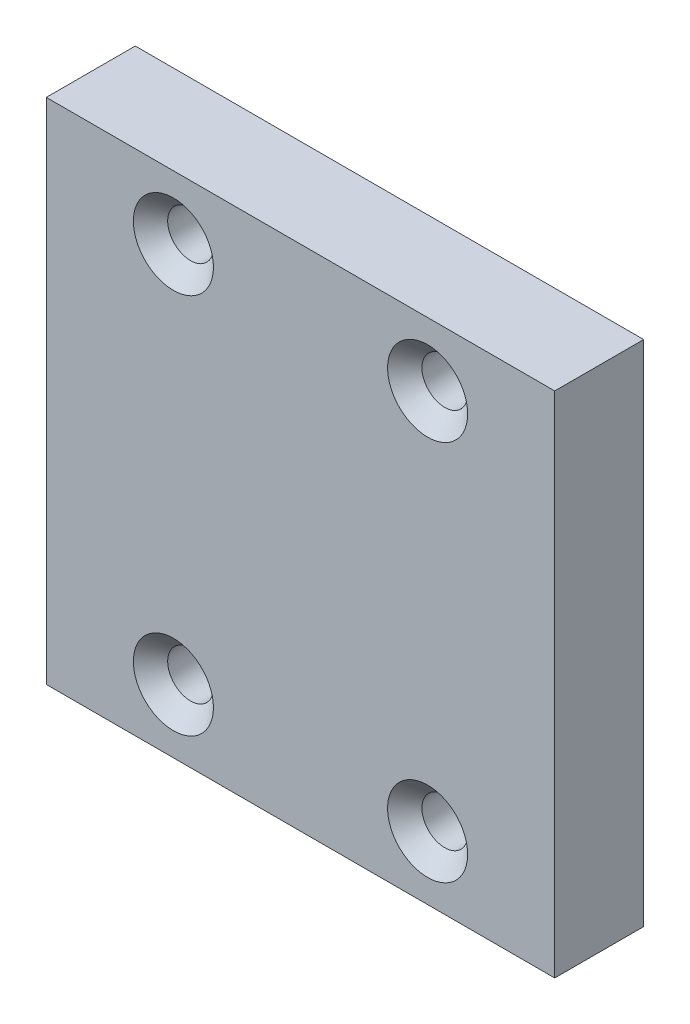
ISO-10303-21;
HEADER;
FILE_DESCRIPTION(('STEP AP214'),'2;1');
FILE_NAME('part.step','',(''),(''),'','','');
FILE_SCHEMA(('AUTOMOTIVE_DESIGN { 1 0 10303 214 1 1 1 1 }'));
ENDSEC;
DATA;
#1=APPLICATION_CONTEXT('core data for automotive mechanical design processes');
#2=APPLICATION_PROTOCOL_DEFINITION('international standard','automotive_design',2000,#1);
#3=PRODUCT_CONTEXT('',#1,'mechanical');
#4=PRODUCT('Part','Part','',(#3));
#5=PRODUCT_RELATED_PRODUCT_CATEGORY('part','',(#4));
#6=PRODUCT_DEFINITION_FORMATION('','',#4);
#7=PRODUCT_DEFINITION_CONTEXT('part definition',#1,'design');
#8=PRODUCT_DEFINITION('design','',#6,#7);
#9=PRODUCT_DEFINITION_SHAPE('','',#8);
#10=(LENGTH_UNIT() NAMED_UNIT(*) SI_UNIT(.MILLI.,.METRE.));
#11=(NAMED_UNIT(*) PLANE_ANGLE_UNIT() SI_UNIT($,.RADIAN.));
#12=(NAMED_UNIT(*) SI_UNIT($,.STERADIAN.) SOLID_ANGLE_UNIT());
#13=UNCERTAINTY_MEASURE_WITH_UNIT(LENGTH_MEASURE(1.E-05),#10,'distance_accuracy_value','');
#14=(GEOMETRIC_REPRESENTATION_CONTEXT(3) GLOBAL_UNCERTAINTY_ASSIGNED_CONTEXT((#13)) GLOBAL_UNIT_ASSIGNED_CONTEXT((#10,
#11,#12)) REPRESENTATION_CONTEXT('',''));
#15=CARTESIAN_POINT('',(0.,0.,0.));
#16=DIRECTION('',(0.,0.,1.));
#17=DIRECTION('',(1.,0.,0.));
#18=AXIS2_PLACEMENT_3D('',#15,#16,#17);
#19=CARTESIAN_POINT('',(-20.,-20.,7.));
#20=DIRECTION('',(1.,0.,0.));
#21=DIRECTION('',(0.,0.,-1.));
#22=AXIS2_PLACEMENT_3D('',#19,#20,#21);
#23=PLANE('',#22);
#24=DIRECTION('',(0.,-1.,0.));
#25=VECTOR('',#24,1.);
#26=CARTESIAN_POINT('',(-20.,-20.,0.));
#27=LINE('',#26,#25);
#28=CARTESIAN_POINT('',(-20.,20.,0.));
#29=VERTEX_POINT('',#28);
#30=CARTESIAN_POINT('',(-20.,-20.,0.));
#31=VERTEX_POINT('',#30);
#32=EDGE_CURVE('E110',#29,#31,#27,.T.);
#33=ORIENTED_EDGE('',*,*,#32,.T.);
#34=DIRECTION('',(0.,0.,-1.));
#35=VECTOR('',#34,1.);
#36=CARTESIAN_POINT('',(-20.,-20.,7.));
#37=LINE('',#36,#35);
#38=CARTESIAN_POINT('',(-20.,-20.,7.));
#39=VERTEX_POINT('',#38);
#40=EDGE_CURVE('E11',#39,#31,#37,.T.);
#41=ORIENTED_EDGE('',*,*,#40,.F.);
#42=DIRECTION('',(0.,-1.,0.));
#43=VECTOR('',#42,1.);
#44=CARTESIAN_POINT('',(-20.,-20.,7.));
#45=LINE('',#44,#43);
#46=CARTESIAN_POINT('',(-20.,20.,7.));
#47=VERTEX_POINT('',#46);
#48=EDGE_CURVE('E93',#47,#39,#45,.T.);
#49=ORIENTED_EDGE('',*,*,#48,.F.);
#50=DIRECTION('',(0.,0.,-1.));
#51=VECTOR('',#50,1.);
#52=CARTESIAN_POINT('',(-20.,20.,7.));
#53=LINE('',#52,#51);
#54=EDGE_CURVE('E106',#47,#29,#53,.T.);
#55=ORIENTED_EDGE('',*,*,#54,.T.);
#56=EDGE_LOOP('',(#33,#41,#49,#55));
#57=FACE_BOUND('',#56,.T.);
#58=ADVANCED_FACE('F39',(#57),#23,.F.);
#59=CARTESIAN_POINT('',(20.,-20.,7.));
#60=DIRECTION('',(0.,1.,0.));
#61=DIRECTION('',(-1.,0.,0.));
#62=AXIS2_PLACEMENT_3D('',#59,#60,#61);
#63=PLANE('',#62);
#64=DIRECTION('',(1.,0.,0.));
#65=VECTOR('',#64,1.);
#66=CARTESIAN_POINT('',(20.,-20.,0.));
#67=LINE('',#66,#65);
#68=CARTESIAN_POINT('',(20.,-20.,0.));
#69=VERTEX_POINT('',#68);
#70=EDGE_CURVE('E98',#31,#69,#67,.T.);
#71=ORIENTED_EDGE('',*,*,#70,.T.);
#72=DIRECTION('',(0.,0.,-1.));
#73=VECTOR('',#72,1.);
#74=CARTESIAN_POINT('',(20.,-20.,7.));
#75=LINE('',#74,#73);
#76=CARTESIAN_POINT('',(20.,-20.,7.));
#77=VERTEX_POINT('',#76);
#78=EDGE_CURVE('E49',#77,#69,#75,.T.);
#79=ORIENTED_EDGE('',*,*,#78,.F.);
#80=DIRECTION('',(1.,0.,0.));
#81=VECTOR('',#80,1.);
#82=CARTESIAN_POINT('',(20.,-20.,7.));
#83=LINE('',#82,#81);
#84=EDGE_CURVE('E88',#39,#77,#83,.T.);
#85=ORIENTED_EDGE('',*,*,#84,.F.);
#86=ORIENTED_EDGE('',*,*,#40,.T.);
#87=EDGE_LOOP('',(#71,#79,#85,#86));
#88=FACE_BOUND('',#87,.T.);
#89=ADVANCED_FACE('F97',(#88),#63,.F.);
#90=CARTESIAN_POINT('',(20.,-20.,7.));
#91=DIRECTION('',(-1.,0.,0.));
#92=DIRECTION('',(0.,0.,1.));
#93=AXIS2_PLACEMENT_3D('',#90,#91,#92);
#94=PLANE('',#93);
#95=DIRECTION('',(0.,1.,0.));
#96=VECTOR('',#95,1.);
#97=CARTESIAN_POINT('',(20.,-20.,0.));
#98=LINE('',#97,#96);
#99=CARTESIAN_POINT('',(20.,20.,0.));
#100=VERTEX_POINT('',#99);
#101=EDGE_CURVE('E75',#69,#100,#98,.T.);
#102=ORIENTED_EDGE('',*,*,#101,.T.);
#103=DIRECTION('',(0.,0.,-1.));
#104=VECTOR('',#103,1.);
#105=CARTESIAN_POINT('',(20.,20.,7.));
#106=LINE('',#105,#104);
#107=CARTESIAN_POINT('',(20.,20.,7.));
#108=VERTEX_POINT('',#107);
#109=EDGE_CURVE('E100',#108,#100,#106,.T.);
#110=ORIENTED_EDGE('',*,*,#109,.F.);
#111=DIRECTION('',(0.,1.,0.));
#112=VECTOR('',#111,1.);
#113=CARTESIAN_POINT('',(20.,-20.,7.));
#114=LINE('',#113,#112);
#115=EDGE_CURVE('E91',#77,#108,#114,.T.);
#116=ORIENTED_EDGE('',*,*,#115,.F.);
#117=ORIENTED_EDGE('',*,*,#78,.T.);
#118=EDGE_LOOP('',(#102,#110,#116,#117));
#119=FACE_BOUND('',#118,.T.);
#120=ADVANCED_FACE('F102',(#119),#94,.F.);
#121=CARTESIAN_POINT('',(20.,20.,7.));
#122=DIRECTION('',(0.,-1.,0.));
#123=DIRECTION('',(1.,0.,0.));
#124=AXIS2_PLACEMENT_3D('',#121,#122,#123);
#125=PLANE('',#124);
#126=DIRECTION('',(-1.,0.,0.));
#127=VECTOR('',#126,1.);
#128=CARTESIAN_POINT('',(20.,20.,0.));
#129=LINE('',#128,#127);
#130=EDGE_CURVE('E81',#100,#29,#129,.T.);
#131=ORIENTED_EDGE('',*,*,#130,.T.);
#132=ORIENTED_EDGE('',*,*,#54,.F.);
#133=DIRECTION('',(-1.,0.,0.));
#134=VECTOR('',#133,1.);
#135=CARTESIAN_POINT('',(20.,20.,7.));
#136=LINE('',#135,#134);
#137=EDGE_CURVE('E58',#108,#47,#136,.T.);
#138=ORIENTED_EDGE('',*,*,#137,.F.);
#139=ORIENTED_EDGE('',*,*,#109,.T.);
#140=EDGE_LOOP('',(#131,#132,#138,#139));
#141=FACE_BOUND('',#140,.T.);
#142=ADVANCED_FACE('F178',(#141),#125,.F.);
#143=CARTESIAN_POINT('',(0.,0.,7.));
#144=DIRECTION('',(0.,0.,1.));
#145=DIRECTION('',(1.,0.,0.));
#146=AXIS2_PLACEMENT_3D('',#143,#144,#145);
#147=PLANE('',#146);
#148=CARTESIAN_POINT('',(10.,-15.,7.));
#149=DIRECTION('',(0.,0.,1.));
#150=DIRECTION('',(1.,0.,0.));
#151=AXIS2_PLACEMENT_3D('',#148,#149,#150);
#152=CIRCLE('',#151,3.15);
#153=CARTESIAN_POINT('',(13.15,-15.,7.));
#154=VERTEX_POINT('',#153);
#155=EDGE_CURVE('E298',#154,#154,#152,.T.);
#156=ORIENTED_EDGE('',*,*,#155,.F.);
#157=EDGE_LOOP('',(#156));
#158=FACE_BOUND('',#157,.T.);
#159=CARTESIAN_POINT('',(10.,15.,7.));
#160=DIRECTION('',(0.,0.,1.));
#161=DIRECTION('',(1.,0.,0.));
#162=AXIS2_PLACEMENT_3D('',#159,#160,#161);
#163=CIRCLE('',#162,3.15);
#164=CARTESIAN_POINT('',(13.15,15.,7.));
#165=VERTEX_POINT('',#164);
#166=EDGE_CURVE('E146',#165,#165,#163,.T.);
#167=ORIENTED_EDGE('',*,*,#166,.F.);
#168=EDGE_LOOP('',(#167));
#169=FACE_BOUND('',#168,.T.);
#170=CARTESIAN_POINT('',(-10.,-15.,7.));
#171=DIRECTION('',(0.,0.,1.));
#172=DIRECTION('',(1.,0.,0.));
#173=AXIS2_PLACEMENT_3D('',#170,#171,#172);
#174=CIRCLE('',#173,3.15);
#175=CARTESIAN_POINT('',(-6.85,-15.,7.));
#176=VERTEX_POINT('',#175);
#177=EDGE_CURVE('E137',#176,#176,#174,.T.);
#178=ORIENTED_EDGE('',*,*,#177,.F.);
#179=EDGE_LOOP('',(#178));
#180=FACE_BOUND('',#179,.T.);
#181=CARTESIAN_POINT('',(-10.,15.,7.));
#182=DIRECTION('',(0.,0.,1.));
#183=DIRECTION('',(1.,0.,0.));
#184=AXIS2_PLACEMENT_3D('',#181,#182,#183);
#185=CIRCLE('',#184,3.15);
#186=CARTESIAN_POINT('',(-6.85,15.,7.));
#187=VERTEX_POINT('',#186);
#188=EDGE_CURVE('E132',#187,#187,#185,.T.);
#189=ORIENTED_EDGE('',*,*,#188,.F.);
#190=EDGE_LOOP('',(#189));
#191=FACE_BOUND('',#190,.T.);
#192=ORIENTED_EDGE('',*,*,#48,.T.);
#193=ORIENTED_EDGE('',*,*,#84,.T.);
#194=ORIENTED_EDGE('',*,*,#115,.T.);
#195=ORIENTED_EDGE('',*,*,#137,.T.);
#196=EDGE_LOOP('',(#192,#193,#194,#195));
#197=FACE_BOUND('',#196,.T.);
#198=ADVANCED_FACE('F89',(#158,#169,#180,#191,#197),#147,.T.);
#199=CARTESIAN_POINT('',(0.,0.,0.));
#200=DIRECTION('',(0.,0.,1.));
#201=DIRECTION('',(1.,0.,0.));
#202=AXIS2_PLACEMENT_3D('',#199,#200,#201);
#203=PLANE('',#202);
#204=CARTESIAN_POINT('',(10.,-15.,0.));
#205=DIRECTION('',(0.,0.,1.));
#206=DIRECTION('',(1.,0.,0.));
#207=AXIS2_PLACEMENT_3D('',#204,#205,#206);
#208=CIRCLE('',#207,1.79999999999999);
#209=CARTESIAN_POINT('',(11.8,-15.,0.));
#210=VERTEX_POINT('',#209);
#211=EDGE_CURVE('E42',#210,#210,#208,.T.);
#212=ORIENTED_EDGE('',*,*,#211,.T.);
#213=EDGE_LOOP('',(#212));
#214=FACE_BOUND('',#213,.T.);
#215=CARTESIAN_POINT('',(10.,15.,0.));
#216=DIRECTION('',(0.,0.,1.));
#217=DIRECTION('',(1.,0.,0.));
#218=AXIS2_PLACEMENT_3D('',#215,#216,#217);
#219=CIRCLE('',#218,1.79999999999999);
#220=CARTESIAN_POINT('',(11.8,15.,0.));
#221=VERTEX_POINT('',#220);
#222=EDGE_CURVE('E134',#221,#221,#219,.T.);
#223=ORIENTED_EDGE('',*,*,#222,.T.);
#224=EDGE_LOOP('',(#223));
#225=FACE_BOUND('',#224,.T.);
#226=CARTESIAN_POINT('',(-10.,-15.,0.));
#227=DIRECTION('',(0.,0.,1.));
#228=DIRECTION('',(1.,0.,0.));
#229=AXIS2_PLACEMENT_3D('',#226,#227,#228);
#230=CIRCLE('',#229,1.79999999999999);
#231=CARTESIAN_POINT('',(-8.20000000000001,-15.,0.));
#232=VERTEX_POINT('',#231);
#233=EDGE_CURVE('E129',#232,#232,#230,.T.);
#234=ORIENTED_EDGE('',*,*,#233,.T.);
#235=EDGE_LOOP('',(#234));
#236=FACE_BOUND('',#235,.T.);
#237=CARTESIAN_POINT('',(-10.,15.,0.));
#238=DIRECTION('',(0.,0.,1.));
#239=DIRECTION('',(1.,0.,0.));
#240=AXIS2_PLACEMENT_3D('',#237,#238,#239);
#241=CIRCLE('',#240,1.79999999999999);
#242=CARTESIAN_POINT('',(-8.20000000000001,15.,0.));
#243=VERTEX_POINT('',#242);
#244=EDGE_CURVE('E114',#243,#243,#241,.T.);
#245=ORIENTED_EDGE('',*,*,#244,.T.);
#246=EDGE_LOOP('',(#245));
#247=FACE_BOUND('',#246,.T.);
#248=ORIENTED_EDGE('',*,*,#32,.F.);
#249=ORIENTED_EDGE('',*,*,#130,.F.);
#250=ORIENTED_EDGE('',*,*,#101,.F.);
#251=ORIENTED_EDGE('',*,*,#70,.F.);
#252=EDGE_LOOP('',(#248,#249,#250,#251));
#253=FACE_BOUND('',#252,.T.);
#254=ADVANCED_FACE('F177',(#214,#225,#236,#247,#253),#203,.F.);
#255=CARTESIAN_POINT('',(-10.,15.,7.));
#256=DIRECTION('',(0.,0.,1.));
#257=DIRECTION('',(1.,0.,0.));
#258=AXIS2_PLACEMENT_3D('',#255,#256,#257);
#259=CYLINDRICAL_SURFACE('',#258,1.79999999999999);
#260=CARTESIAN_POINT('',(-10.,15.,5.65));
#261=DIRECTION('',(0.,0.,1.));
#262=DIRECTION('',(1.,0.,0.));
#263=AXIS2_PLACEMENT_3D('',#260,#261,#262);
#264=CIRCLE('',#263,1.8);
#265=CARTESIAN_POINT('',(-8.2,15.,5.65));
#266=VERTEX_POINT('',#265);
#267=EDGE_CURVE('E128',#266,#266,#264,.T.);
#268=ORIENTED_EDGE('',*,*,#267,.T.);
#269=EDGE_LOOP('',(#268));
#270=FACE_BOUND('',#269,.T.);
#271=ORIENTED_EDGE('',*,*,#244,.F.);
#272=EDGE_LOOP('',(#271));
#273=FACE_BOUND('',#272,.T.);
#274=ADVANCED_FACE('F166',(#270,#273),#259,.F.);
#275=CARTESIAN_POINT('',(-10.,15.,7.));
#276=DIRECTION('',(0.,0.,1.));
#277=DIRECTION('',(1.,0.,0.));
#278=AXIS2_PLACEMENT_3D('',#275,#276,#277);
#279=CONICAL_SURFACE('',#278,3.15,0.785398163397448);
#280=ORIENTED_EDGE('',*,*,#267,.F.);
#281=EDGE_LOOP('',(#280));
#282=FACE_BOUND('',#281,.T.);
#283=ORIENTED_EDGE('',*,*,#188,.T.);
#284=EDGE_LOOP('',(#283));
#285=FACE_BOUND('',#284,.T.);
#286=ADVANCED_FACE('F169',(#282,#285),#279,.F.);
#287=CARTESIAN_POINT('',(-10.,-15.,7.));
#288=DIRECTION('',(0.,0.,1.));
#289=DIRECTION('',(1.,0.,0.));
#290=AXIS2_PLACEMENT_3D('',#287,#288,#289);
#291=CYLINDRICAL_SURFACE('',#290,1.79999999999999);
#292=CARTESIAN_POINT('',(-10.,-15.,5.65));
#293=DIRECTION('',(0.,0.,1.));
#294=DIRECTION('',(1.,0.,0.));
#295=AXIS2_PLACEMENT_3D('',#292,#293,#294);
#296=CIRCLE('',#295,1.8);
#297=CARTESIAN_POINT('',(-8.2,-15.,5.65));
#298=VERTEX_POINT('',#297);
#299=EDGE_CURVE('E133',#298,#298,#296,.T.);
#300=ORIENTED_EDGE('',*,*,#299,.T.);
#301=EDGE_LOOP('',(#300));
#302=FACE_BOUND('',#301,.T.);
#303=ORIENTED_EDGE('',*,*,#233,.F.);
#304=EDGE_LOOP('',(#303));
#305=FACE_BOUND('',#304,.T.);
#306=ADVANCED_FACE('F172',(#302,#305),#291,.F.);
#307=CARTESIAN_POINT('',(-10.,-15.,7.));
#308=DIRECTION('',(0.,0.,1.));
#309=DIRECTION('',(1.,0.,0.));
#310=AXIS2_PLACEMENT_3D('',#307,#308,#309);
#311=CONICAL_SURFACE('',#310,3.15,0.785398163397448);
#312=ORIENTED_EDGE('',*,*,#299,.F.);
#313=EDGE_LOOP('',(#312));
#314=FACE_BOUND('',#313,.T.);
#315=ORIENTED_EDGE('',*,*,#177,.T.);
#316=EDGE_LOOP('',(#315));
#317=FACE_BOUND('',#316,.T.);
#318=ADVANCED_FACE('F240',(#314,#317),#311,.F.);
#319=CARTESIAN_POINT('',(10.,15.,7.));
#320=DIRECTION('',(0.,0.,1.));
#321=DIRECTION('',(1.,0.,0.));
#322=AXIS2_PLACEMENT_3D('',#319,#320,#321);
#323=CYLINDRICAL_SURFACE('',#322,1.79999999999999);
#324=CARTESIAN_POINT('',(10.,15.,5.65));
#325=DIRECTION('',(0.,0.,1.));
#326=DIRECTION('',(1.,0.,0.));
#327=AXIS2_PLACEMENT_3D('',#324,#325,#326);
#328=CIRCLE('',#327,1.8);
#329=CARTESIAN_POINT('',(11.8,15.,5.65));
#330=VERTEX_POINT('',#329);
#331=EDGE_CURVE('E138',#330,#330,#328,.T.);
#332=ORIENTED_EDGE('',*,*,#331,.T.);
#333=EDGE_LOOP('',(#332));
#334=FACE_BOUND('',#333,.T.);
#335=ORIENTED_EDGE('',*,*,#222,.F.);
#336=EDGE_LOOP('',(#335));
#337=FACE_BOUND('',#336,.T.);
#338=ADVANCED_FACE('F250',(#334,#337),#323,.F.);
#339=CARTESIAN_POINT('',(10.,15.,7.));
#340=DIRECTION('',(0.,0.,1.));
#341=DIRECTION('',(1.,0.,0.));
#342=AXIS2_PLACEMENT_3D('',#339,#340,#341);
#343=CONICAL_SURFACE('',#342,3.15,0.785398163397448);
#344=ORIENTED_EDGE('',*,*,#331,.F.);
#345=EDGE_LOOP('',(#344));
#346=FACE_BOUND('',#345,.T.);
#347=ORIENTED_EDGE('',*,*,#166,.T.);
#348=EDGE_LOOP('',(#347));
#349=FACE_BOUND('',#348,.T.);
#350=ADVANCED_FACE('F260',(#346,#349),#343,.F.);
#351=CARTESIAN_POINT('',(10.,-15.,7.));
#352=DIRECTION('',(0.,0.,1.));
#353=DIRECTION('',(1.,0.,0.));
#354=AXIS2_PLACEMENT_3D('',#351,#352,#353);
#355=CYLINDRICAL_SURFACE('',#354,1.79999999999999);
#356=CARTESIAN_POINT('',(10.,-15.,5.65));
#357=DIRECTION('',(0.,0.,1.));
#358=DIRECTION('',(1.,0.,0.));
#359=AXIS2_PLACEMENT_3D('',#356,#357,#358);
#360=CIRCLE('',#359,1.8);
#361=CARTESIAN_POINT('',(11.8,-15.,5.65));
#362=VERTEX_POINT('',#361);
#363=EDGE_CURVE('E296',#362,#362,#360,.T.);
#364=ORIENTED_EDGE('',*,*,#363,.T.);
#365=EDGE_LOOP('',(#364));
#366=FACE_BOUND('',#365,.T.);
#367=ORIENTED_EDGE('',*,*,#211,.F.);
#368=EDGE_LOOP('',(#367));
#369=FACE_BOUND('',#368,.T.);
#370=ADVANCED_FACE('F269',(#366,#369),#355,.F.);
#371=CARTESIAN_POINT('',(10.,-15.,7.));
#372=DIRECTION('',(0.,0.,1.));
#373=DIRECTION('',(1.,0.,0.));
#374=AXIS2_PLACEMENT_3D('',#371,#372,#373);
#375=CONICAL_SURFACE('',#374,3.15,0.785398163397448);
#376=ORIENTED_EDGE('',*,*,#363,.F.);
#377=EDGE_LOOP('',(#376));
#378=FACE_BOUND('',#377,.T.);
#379=ORIENTED_EDGE('',*,*,#155,.T.);
#380=EDGE_LOOP('',(#379));
#381=FACE_BOUND('',#380,.T.);
#382=ADVANCED_FACE('F279',(#378,#381),#375,.F.);
#383=CLOSED_SHELL('',(#58,#89,#120,#142,#198,#254,#274,#286,#306,#318,#338,#350,#370,#382));
#384=MANIFOLD_SOLID_BREP('B2',#383);
#385=ADVANCED_BREP_SHAPE_REPRESENTATION('',(#18,#384),#14);
#386=SHAPE_DEFINITION_REPRESENTATION(#9,#385);
ENDSEC;
END-ISO-10303-21;
